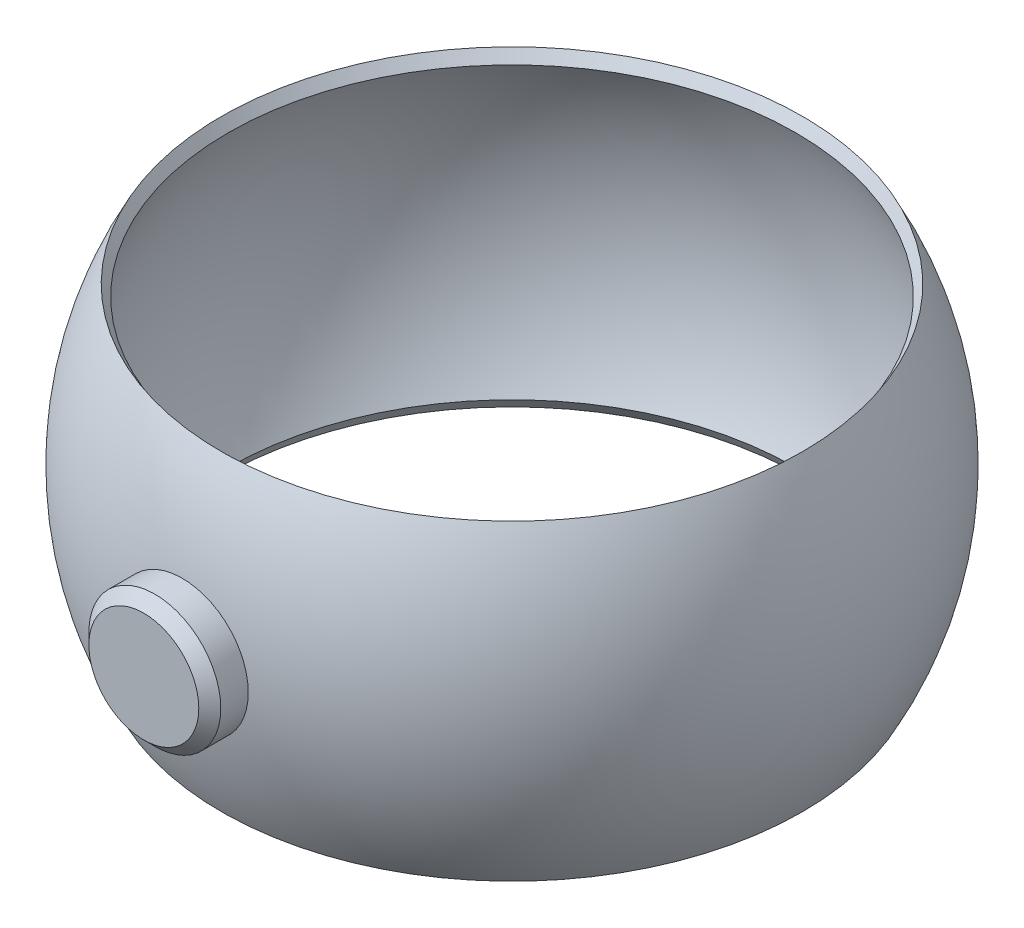
ISO-10303-21;
HEADER;
FILE_DESCRIPTION(('STEP AP214'),'2;1');
FILE_NAME('part.step','',(''),(''),'','','');
FILE_SCHEMA(('AUTOMOTIVE_DESIGN { 1 0 10303 214 1 1 1 1 }'));
ENDSEC;
DATA;
#1=APPLICATION_CONTEXT('core data for automotive mechanical design processes');
#2=APPLICATION_PROTOCOL_DEFINITION('international standard','automotive_design',2000,#1);
#3=PRODUCT_CONTEXT('',#1,'mechanical');
#4=PRODUCT('Part','Part','',(#3));
#5=PRODUCT_RELATED_PRODUCT_CATEGORY('part','',(#4));
#6=PRODUCT_DEFINITION_FORMATION('','',#4);
#7=PRODUCT_DEFINITION_CONTEXT('part definition',#1,'design');
#8=PRODUCT_DEFINITION('design','',#6,#7);
#9=PRODUCT_DEFINITION_SHAPE('','',#8);
#10=(LENGTH_UNIT() NAMED_UNIT(*) SI_UNIT(.MILLI.,.METRE.));
#11=(NAMED_UNIT(*) PLANE_ANGLE_UNIT() SI_UNIT($,.RADIAN.));
#12=(NAMED_UNIT(*) SI_UNIT($,.STERADIAN.) SOLID_ANGLE_UNIT());
#13=UNCERTAINTY_MEASURE_WITH_UNIT(LENGTH_MEASURE(1.E-05),#10,'distance_accuracy_value','');
#14=(GEOMETRIC_REPRESENTATION_CONTEXT(3) GLOBAL_UNCERTAINTY_ASSIGNED_CONTEXT((#13)) GLOBAL_UNIT_ASSIGNED_CONTEXT((#10,
#11,#12)) REPRESENTATION_CONTEXT('',''));
#15=CARTESIAN_POINT('',(0.,0.,0.));
#16=DIRECTION('',(0.,0.,1.));
#17=DIRECTION('',(1.,0.,0.));
#18=AXIS2_PLACEMENT_3D('',#15,#16,#17);
#19=CARTESIAN_POINT('',(0.,0.,16.75));
#20=DIRECTION('',(0.,0.,-1.));
#21=DIRECTION('',(-1.,0.,0.));
#22=AXIS2_PLACEMENT_3D('',#19,#20,#21);
#23=CYLINDRICAL_SURFACE('',#22,3.);
#24=CARTESIAN_POINT('',(0.,0.,16.25));
#25=DIRECTION('',(0.,0.,1.));
#26=DIRECTION('',(1.,0.,0.));
#27=AXIS2_PLACEMENT_3D('',#24,#25,#26);
#28=CIRCLE('',#27,3.);
#29=CARTESIAN_POINT('',(3.,0.,16.25));
#30=VERTEX_POINT('',#29);
#31=EDGE_CURVE('E11',#30,#30,#28,.F.);
#32=ORIENTED_EDGE('',*,*,#31,.T.);
#33=EDGE_LOOP('',(#32));
#34=FACE_BOUND('',#33,.T.);
#35=CARTESIAN_POINT('',(0.,0.,15.));
#36=DIRECTION('',(0.,0.,1.));
#37=DIRECTION('',(1.,0.,0.));
#38=AXIS2_PLACEMENT_3D('',#35,#36,#37);
#39=CIRCLE('',#38,3.);
#40=CARTESIAN_POINT('',(3.,0.,15.));
#41=VERTEX_POINT('',#40);
#42=EDGE_CURVE('E54',#41,#41,#39,.T.);
#43=ORIENTED_EDGE('',*,*,#42,.T.);
#44=EDGE_LOOP('',(#43));
#45=FACE_BOUND('',#44,.T.);
#46=ADVANCED_FACE('F43',(#34,#45),#23,.T.);
#47=CARTESIAN_POINT('',(0.,0.,16.75));
#48=DIRECTION('',(0.,0.,1.));
#49=DIRECTION('',(1.,0.,0.));
#50=AXIS2_PLACEMENT_3D('',#47,#48,#49);
#51=PLANE('',#50);
#52=CARTESIAN_POINT('',(0.,0.,16.75));
#53=DIRECTION('',(0.,0.,1.));
#54=DIRECTION('',(1.,0.,0.));
#55=AXIS2_PLACEMENT_3D('',#52,#53,#54);
#56=CIRCLE('',#55,2.5);
#57=CARTESIAN_POINT('',(2.5,0.,16.75));
#58=VERTEX_POINT('',#57);
#59=EDGE_CURVE('E50',#58,#58,#56,.T.);
#60=ORIENTED_EDGE('',*,*,#59,.T.);
#61=EDGE_LOOP('',(#60));
#62=FACE_BOUND('',#61,.T.);
#63=ADVANCED_FACE('F64',(#62),#51,.T.);
#64=CARTESIAN_POINT('',(0.,0.,15.));
#65=DIRECTION('',(0.,0.,1.));
#66=DIRECTION('',(1.,0.,0.));
#67=AXIS2_PLACEMENT_3D('',#64,#65,#66);
#68=PLANE('',#67);
#69=ORIENTED_EDGE('',*,*,#42,.F.);
#70=EDGE_LOOP('',(#69));
#71=FACE_BOUND('',#70,.T.);
#72=ADVANCED_FACE('F62',(#71),#68,.F.);
#73=CARTESIAN_POINT('',(0.,0.,16.75));
#74=DIRECTION('',(0.,0.,-1.));
#75=DIRECTION('',(-1.,0.,0.));
#76=AXIS2_PLACEMENT_3D('',#73,#74,#75);
#77=CONICAL_SURFACE('',#76,2.5,0.785398163397448);
#78=ORIENTED_EDGE('',*,*,#31,.F.);
#79=EDGE_LOOP('',(#78));
#80=FACE_BOUND('',#79,.T.);
#81=ORIENTED_EDGE('',*,*,#59,.F.);
#82=EDGE_LOOP('',(#81));
#83=FACE_BOUND('',#82,.T.);
#84=ADVANCED_FACE('F45',(#80,#83),#77,.T.);
#85=CLOSED_SHELL('',(#46,#63,#72,#84));
#86=MANIFOLD_SOLID_BREP('B2',#85);
#87=CARTESIAN_POINT('',(0.,0.,0.));
#88=DIRECTION('',(0.,1.,0.));
#89=DIRECTION('',(1.,0.,0.));
#90=AXIS2_PLACEMENT_3D('',#87,#88,#89);
#91=SPHERICAL_SURFACE('',#90,15.);
#92=CARTESIAN_POINT('',(0.,-7.09412519475043,0.));
#93=DIRECTION('',(0.,-1.,0.));
#94=DIRECTION('',(1.,0.,0.));
#95=AXIS2_PLACEMENT_3D('',#92,#93,#94);
#96=CIRCLE('',#95,13.2164060062185);
#97=CARTESIAN_POINT('',(13.2164060062185,-7.09412519475043,0.));
#98=VERTEX_POINT('',#97);
#99=EDGE_CURVE('E110',#98,#98,#96,.F.);
#100=CARTESIAN_POINT('',(0.,7.09412519475043,0.));
#101=DIRECTION('',(0.,1.,0.));
#102=DIRECTION('',(-1.,0.,0.));
#103=AXIS2_PLACEMENT_3D('',#100,#101,#102);
#104=CIRCLE('',#103,13.2164060062184);
#105=CARTESIAN_POINT('',(13.2164060062185,7.09412519475043,0.));
#106=VERTEX_POINT('',#105);
#107=EDGE_CURVE('E114',#106,#106,#104,.F.);
#108=CARTESIAN_POINT('',(13.2164060062185,-7.09412519475043,0.));
#109=CARTESIAN_POINT('',(13.2892140994923,-6.95848490105075,0.));
#110=CARTESIAN_POINT('',(13.3599326462828,-6.82172305743305,0.));
#111=CARTESIAN_POINT('',(13.4971267849507,-6.54608748532926,0.));
#112=CARTESIAN_POINT('',(13.563602376828,-6.40721375684316,0.));
#113=CARTESIAN_POINT('',(13.6922467437226,-6.12748562997027,0.));
#114=CARTESIAN_POINT('',(13.7544155187398,-5.98663123158347,0.));
#115=CARTESIAN_POINT('',(13.8743875500473,-5.70307539374213,0.));
#116=CARTESIAN_POINT('',(13.9321908063377,-5.56037395428759,0.));
#117=CARTESIAN_POINT('',(14.0433769476292,-5.27325927022233,0.));
#118=CARTESIAN_POINT('',(14.0967598326304,-5.12884602561161,0.));
#119=CARTESIAN_POINT('',(14.1990546462109,-4.83844462827208,0.));
#120=CARTESIAN_POINT('',(14.2479665747902,-4.69245647554327,0.));
#121=CARTESIAN_POINT('',(14.3412731076693,-4.39904364153748,0.));
#122=CARTESIAN_POINT('',(14.3856677119691,-4.25161896026049,0.));
#123=CARTESIAN_POINT('',(14.4698975159452,-3.95547281317449,0.));
#124=CARTESIAN_POINT('',(14.5097327156214,-3.80675134736548,0.));
#125=CARTESIAN_POINT('',(14.5848059503646,-3.50815260370908,0.));
#126=CARTESIAN_POINT('',(14.6200439854314,-3.35827532586169,0.));
#127=CARTESIAN_POINT('',(14.6858894890078,-3.05750702641157,0.));
#128=CARTESIAN_POINT('',(14.7164969575174,-2.90661600480884,0.));
#129=CARTESIAN_POINT('',(14.7730523152251,-2.60396324700271,0.));
#130=CARTESIAN_POINT('',(14.7990002044232,-2.4522015107993,0.));
#131=CARTESIAN_POINT('',(14.8462118075846,-2.14795117830858,0.));
#132=CARTESIAN_POINT('',(14.8674755215478,-1.99546258202128,0.));
#133=CARTESIAN_POINT('',(14.9052986184243,-1.6899030728643,0.));
#134=CARTESIAN_POINT('',(14.9218580013375,-1.53683215999463,0.));
#135=CARTESIAN_POINT('',(14.950256739523,-1.23025311315172,0.));
#136=CARTESIAN_POINT('',(14.9620960947952,-1.07674497917847,0.));
#137=CARTESIAN_POINT('',(14.9810435552077,-0.769437000047544,0.));
#138=CARTESIAN_POINT('',(14.988151660348,-0.615637154889857,0.));
#139=CARTESIAN_POINT('',(14.9976298827441,-0.307891539821447,0.));
#140=CARTESIAN_POINT('',(15.,-0.153945769910722,0.));
#141=CARTESIAN_POINT('',(15.,0.153945769910727,0.));
#142=CARTESIAN_POINT('',(14.9976298827441,0.307891539821452,0.));
#143=CARTESIAN_POINT('',(14.988151660348,0.615637154889862,0.));
#144=CARTESIAN_POINT('',(14.9810435552077,0.769437000047548,0.));
#145=CARTESIAN_POINT('',(14.9620960947952,1.07674497917848,0.));
#146=CARTESIAN_POINT('',(14.950256739523,1.23025311315172,0.));
#147=CARTESIAN_POINT('',(14.9218580013375,1.53683215999464,0.));
#148=CARTESIAN_POINT('',(14.9052986184243,1.6899030728643,0.));
#149=CARTESIAN_POINT('',(14.8674755215478,1.99546258202128,0.));
#150=CARTESIAN_POINT('',(14.8462118075846,2.14795117830859,0.));
#151=CARTESIAN_POINT('',(14.7990002044232,2.4522015107993,0.));
#152=CARTESIAN_POINT('',(14.7730523152251,2.60396324700271,0.));
#153=CARTESIAN_POINT('',(14.7164969575174,2.90661600480885,0.));
#154=CARTESIAN_POINT('',(14.6858894890078,3.05750702641157,0.));
#155=CARTESIAN_POINT('',(14.6200439854314,3.3582753258617,0.));
#156=CARTESIAN_POINT('',(14.5848059503646,3.50815260370909,0.));
#157=CARTESIAN_POINT('',(14.5097327156214,3.80675134736549,0.));
#158=CARTESIAN_POINT('',(14.4698975159452,3.95547281317449,0.));
#159=CARTESIAN_POINT('',(14.3856677119691,4.25161896026049,0.));
#160=CARTESIAN_POINT('',(14.3412731076693,4.39904364153748,0.));
#161=CARTESIAN_POINT('',(14.2479665747902,4.69245647554328,0.));
#162=CARTESIAN_POINT('',(14.1990546462109,4.83844462827208,0.));
#163=CARTESIAN_POINT('',(14.0967598326304,5.12884602561161,0.));
#164=CARTESIAN_POINT('',(14.0433769476292,5.27325927022233,0.));
#165=CARTESIAN_POINT('',(13.9321908063377,5.5603739542876,0.));
#166=CARTESIAN_POINT('',(13.8743875500473,5.70307539374214,0.));
#167=CARTESIAN_POINT('',(13.7544155187398,5.98663123158348,0.));
#168=CARTESIAN_POINT('',(13.6922467437226,6.12748562997028,0.));
#169=CARTESIAN_POINT('',(13.563602376828,6.40721375684317,0.));
#170=CARTESIAN_POINT('',(13.4971267849507,6.54608748532926,0.));
#171=CARTESIAN_POINT('',(13.3599326462828,6.82172305743306,0.));
#172=CARTESIAN_POINT('',(13.2892140994923,6.95848490105076,0.));
#173=CARTESIAN_POINT('',(13.2164060062185,7.09412519475043,0.));
#174=B_SPLINE_CURVE_WITH_KNOTS('',3,(#108,#109,#110,#111,#112,#113,#114,#115,#116,#117,#118,
#119,#120,#121,#122,#123,#124,#125,#126,#127,#128,#129,#130,#131,#132,#133,#134,#135,#136,#137,
#138,#139,#140,#141,#142,#143,#144,#145,#146,#147,#148,#149,#150,#151,#152,#153,#154,#155,#156,
#157,#158,#159,#160,#161,#162,#163,#164,#165,#166,#167,#168,#169,#170,#171,#172,#173),
.UNSPECIFIED.,.F.,.F.,(4,2,2,2,2,2,2,2,2,2,2,2,2,2,2,2,2,2,2,2,2,2,2,2,2,2,2,2,2,2,2,2,4),(0.,
0.461819070219067,0.923638140438135,1.3854572106572,1.84727628087627,2.30909535109534,
2.7709144213144,3.23273349153347,3.69455256175254,4.1563716319716,4.61819070219067,
5.08000977240974,5.5418288426288,6.00364791284787,6.46546698306694,6.92728605328601,
7.38910512350507,7.85092419372414,8.31274326394321,8.77456233416228,9.23638140438134,
9.69820047460041,10.1600195448195,10.6218386150385,11.0836576852576,11.5454767554767,
12.0072958256957,12.4691148959148,12.9309339661339,13.3927530363529,13.854572106572,
14.3163911767911,14.7782102470102),.UNSPECIFIED.);
#175=EDGE_CURVE('BSEAM99',#98,#106,#174,.T.);
#176=ORIENTED_EDGE('',*,*,#99,.T.);
#177=ORIENTED_EDGE('',*,*,#107,.T.);
#178=ORIENTED_EDGE('',*,*,#175,.T.);
#179=ORIENTED_EDGE('',*,*,#175,.F.);
#180=EDGE_LOOP('',(#176,#178,#177,#179));
#181=FACE_BOUND('',#180,.T.);
#182=ADVANCED_FACE('F99',(#181),#91,.T.);
#183=CARTESIAN_POINT('',(0.,0.,0.));
#184=DIRECTION('',(0.,1.,0.));
#185=DIRECTION('',(1.,0.,0.));
#186=AXIS2_PLACEMENT_3D('',#183,#184,#185);
#187=SPHERICAL_SURFACE('',#186,14.5);
#188=CARTESIAN_POINT('',(0.,-6.59720870724725,0.));
#189=DIRECTION('',(0.,1.,0.));
#190=DIRECTION('',(-1.,0.,0.));
#191=AXIS2_PLACEMENT_3D('',#188,#189,#190);
#192=CIRCLE('',#191,12.9122746746273);
#193=CARTESIAN_POINT('',(12.9122746746273,-6.59720870724725,0.));
#194=VERTEX_POINT('',#193);
#195=EDGE_CURVE('E42',#194,#194,#192,.F.);
#196=CARTESIAN_POINT('',(0.,6.59720870724725,0.));
#197=DIRECTION('',(0.,-1.,0.));
#198=DIRECTION('',(1.,0.,0.));
#199=AXIS2_PLACEMENT_3D('',#196,#197,#198);
#200=CIRCLE('',#199,12.9122746746273);
#201=CARTESIAN_POINT('',(12.9122746746273,6.59720870724726,0.));
#202=VERTEX_POINT('',#201);
#203=EDGE_CURVE('E106',#202,#202,#200,.F.);
#204=CARTESIAN_POINT('',(12.9122746746273,-6.59720870724725,0.));
#205=CARTESIAN_POINT('',(12.9771958794491,-6.47014423019073,0.));
#206=CARTESIAN_POINT('',(13.0402403227754,-6.34212090592104,0.));
#207=CARTESIAN_POINT('',(13.1625233604889,-6.08426937279662,0.));
#208=CARTESIAN_POINT('',(13.2217619548761,-5.95444116394189,0.));
#209=CARTESIAN_POINT('',(13.336380968764,-5.69309267148869,0.));
#210=CARTESIAN_POINT('',(13.3917613882647,-5.56157238789023,0.));
#211=CARTESIAN_POINT('',(13.4986159774497,-5.29695445185548,0.));
#212=CARTESIAN_POINT('',(13.550090147134,-5.1638567994192,0.));
#213=CARTESIAN_POINT('',(13.6490873278331,-4.89620009332448,0.));
#214=CARTESIAN_POINT('',(13.6966103388478,-4.76164103966604,0.));
#215=CARTESIAN_POINT('',(13.7876638005024,-4.49117880257908,0.));
#216=CARTESIAN_POINT('',(13.8311942511424,-4.35527561915056,0.));
#217=CARTESIAN_POINT('',(13.9142246526686,-4.08224355724505,0.));
#218=CARTESIAN_POINT('',(13.9537246035548,-3.94511467876805,0.));
#219=CARTESIAN_POINT('',(14.0286595832611,-3.66975073182422,0.));
#220=CARTESIAN_POINT('',(14.0640946120813,-3.53151566335737,0.));
#221=CARTESIAN_POINT('',(14.1308688666003,-3.25405980492893,0.));
#222=CARTESIAN_POINT('',(14.1622080922991,-3.11483901496733,0.));
#223=CARTESIAN_POINT('',(14.220763429245,-2.83553304123362,0.));
#224=CARTESIAN_POINT('',(14.2479795404921,-2.69544785746151,0.));
#225=CARTESIAN_POINT('',(14.2982649303139,-2.41453517704813,0.));
#226=CARTESIAN_POINT('',(14.3213342088885,-2.27370768040686,0.));
#227=CARTESIAN_POINT('',(14.3633058290353,-1.99143310211597,0.));
#228=CARTESIAN_POINT('',(14.3822081706075,-1.84998602046636,0.));
#229=CARTESIAN_POINT('',(14.415829443801,-1.56659553997037,0.));
#230=CARTESIAN_POINT('',(14.4305483754223,-1.424652141124,0.));
#231=CARTESIAN_POINT('',(14.455790001511,-1.1403927265757,0.));
#232=CARTESIAN_POINT('',(14.4663126959783,-0.998076710873772,0.));
#233=CARTESIAN_POINT('',(14.4831526774776,-0.713196087682176,0.));
#234=CARTESIAN_POINT('',(14.4894699645096,-0.570631480192509,0.));
#235=CARTESIAN_POINT('',(14.4978936257708,-0.285377915135227,0.));
#236=CARTESIAN_POINT('',(14.5,-0.142688957567611,0.));
#237=CARTESIAN_POINT('',(14.5,0.14268895756762,0.));
#238=CARTESIAN_POINT('',(14.4978936257708,0.285377915135236,0.));
#239=CARTESIAN_POINT('',(14.4894699645096,0.570631480192519,0.));
#240=CARTESIAN_POINT('',(14.4831526774776,0.713196087682185,0.));
#241=CARTESIAN_POINT('',(14.4663126959783,0.998076710873781,0.));
#242=CARTESIAN_POINT('',(14.455790001511,1.14039272657571,0.));
#243=CARTESIAN_POINT('',(14.4305483754223,1.42465214112401,0.));
#244=CARTESIAN_POINT('',(14.415829443801,1.56659553997038,0.));
#245=CARTESIAN_POINT('',(14.3822081706075,1.84998602046637,0.));
#246=CARTESIAN_POINT('',(14.3633058290353,1.99143310211598,0.));
#247=CARTESIAN_POINT('',(14.3213342088885,2.27370768040687,0.));
#248=CARTESIAN_POINT('',(14.2982649303139,2.41453517704814,0.));
#249=CARTESIAN_POINT('',(14.2479795404921,2.69544785746152,0.));
#250=CARTESIAN_POINT('',(14.220763429245,2.83553304123363,0.));
#251=CARTESIAN_POINT('',(14.1622080922991,3.11483901496734,0.));
#252=CARTESIAN_POINT('',(14.1308688666003,3.25405980492894,0.));
#253=CARTESIAN_POINT('',(14.0640946120813,3.53151566335738,0.));
#254=CARTESIAN_POINT('',(14.0286595832611,3.66975073182422,0.));
#255=CARTESIAN_POINT('',(13.9537246035548,3.94511467876806,0.));
#256=CARTESIAN_POINT('',(13.9142246526686,4.08224355724505,0.));
#257=CARTESIAN_POINT('',(13.8311942511424,4.35527561915057,0.));
#258=CARTESIAN_POINT('',(13.7876638005024,4.49117880257909,0.));
#259=CARTESIAN_POINT('',(13.6966103388478,4.76164103966605,0.));
#260=CARTESIAN_POINT('',(13.6490873278331,4.89620009332449,0.));
#261=CARTESIAN_POINT('',(13.550090147134,5.16385679941921,0.));
#262=CARTESIAN_POINT('',(13.4986159774497,5.29695445185549,0.));
#263=CARTESIAN_POINT('',(13.3917613882647,5.56157238789024,0.));
#264=CARTESIAN_POINT('',(13.336380968764,5.6930926714887,0.));
#265=CARTESIAN_POINT('',(13.2217619548761,5.95444116394189,0.));
#266=CARTESIAN_POINT('',(13.1625233604889,6.08426937279662,0.));
#267=CARTESIAN_POINT('',(13.0402403227754,6.34212090592104,0.));
#268=CARTESIAN_POINT('',(12.9771958794491,6.47014423019074,0.));
#269=CARTESIAN_POINT('',(12.9122746746273,6.59720870724726,0.));
#270=B_SPLINE_CURVE_WITH_KNOTS('',3,(#204,#205,#206,#207,#208,#209,#210,#211,#212,#213,#214,
#215,#216,#217,#218,#219,#220,#221,#222,#223,#224,#225,#226,#227,#228,#229,#230,#231,#232,#233,
#234,#235,#236,#237,#238,#239,#240,#241,#242,#243,#244,#245,#246,#247,#248,#249,#250,#251,#252,
#253,#254,#255,#256,#257,#258,#259,#260,#261,#262,#263,#264,#265,#266,#267,#268,#269),
.UNSPECIFIED.,.F.,.F.,(4,2,2,2,2,2,2,2,2,2,2,2,2,2,2,2,2,2,2,2,2,2,2,2,2,2,2,2,2,2,2,2,4),(0.,
0.428051329790007,0.856102659580014,1.28415398937002,1.71220531916003,2.14025664895004,
2.56830797874004,2.99635930853005,3.42441063832006,3.85246196811007,4.28051329790007,
4.70856462769008,5.13661595748009,5.5646672872701,5.9927186170601,6.42076994685011,
6.84882127664012,7.27687260643013,7.70492393622013,8.13297526601014,8.56102659580015,
8.98907792559016,9.41712925538016,9.84518058517017,10.2732319149602,10.7012832447502,
11.1293345745402,11.5573859043302,11.9854372341202,12.4134885639102,12.8415398937002,
13.2695912234902,13.6976425532802),.UNSPECIFIED.);
#271=EDGE_CURVE('BSEAM127',#194,#202,#270,.T.);
#272=ORIENTED_EDGE('',*,*,#195,.T.);
#273=ORIENTED_EDGE('',*,*,#203,.T.);
#274=ORIENTED_EDGE('',*,*,#271,.T.);
#275=ORIENTED_EDGE('',*,*,#271,.F.);
#276=EDGE_LOOP('',(#272,#274,#273,#275));
#277=FACE_BOUND('',#276,.T.);
#278=ADVANCED_FACE('F127',(#277),#187,.F.);
#279=CARTESIAN_POINT('',(0.,-7.5,0.));
#280=DIRECTION('',(0.,-1.,0.));
#281=DIRECTION('',(1.,0.,0.));
#282=AXIS2_PLACEMENT_3D('',#279,#280,#281);
#283=CONICAL_SURFACE('',#282,13.4648164495911,0.549223336081899);
#284=ORIENTED_EDGE('',*,*,#195,.F.);
#285=EDGE_LOOP('',(#284));
#286=FACE_BOUND('',#285,.T.);
#287=ORIENTED_EDGE('',*,*,#99,.F.);
#288=EDGE_LOOP('',(#287));
#289=FACE_BOUND('',#288,.T.);
#290=ADVANCED_FACE('F123',(#286,#289),#283,.F.);
#291=CARTESIAN_POINT('',(0.,6.59720870724725,0.));
#292=DIRECTION('',(0.,1.,0.));
#293=DIRECTION('',(-1.,0.,0.));
#294=AXIS2_PLACEMENT_3D('',#291,#292,#293);
#295=CONICAL_SURFACE('',#294,12.9122746746273,0.5492233360819);
#296=ORIENTED_EDGE('',*,*,#107,.F.);
#297=EDGE_LOOP('',(#296));
#298=FACE_BOUND('',#297,.T.);
#299=ORIENTED_EDGE('',*,*,#203,.F.);
#300=EDGE_LOOP('',(#299));
#301=FACE_BOUND('',#300,.T.);
#302=ADVANCED_FACE('F101',(#298,#301),#295,.F.);
#303=CLOSED_SHELL('',(#182,#278,#290,#302));
#304=MANIFOLD_SOLID_BREP('B6',#303);
#305=ADVANCED_BREP_SHAPE_REPRESENTATION('',(#18,#86,#304),#14);
#306=SHAPE_DEFINITION_REPRESENTATION(#9,#305);
ENDSEC;
END-ISO-10303-21;
